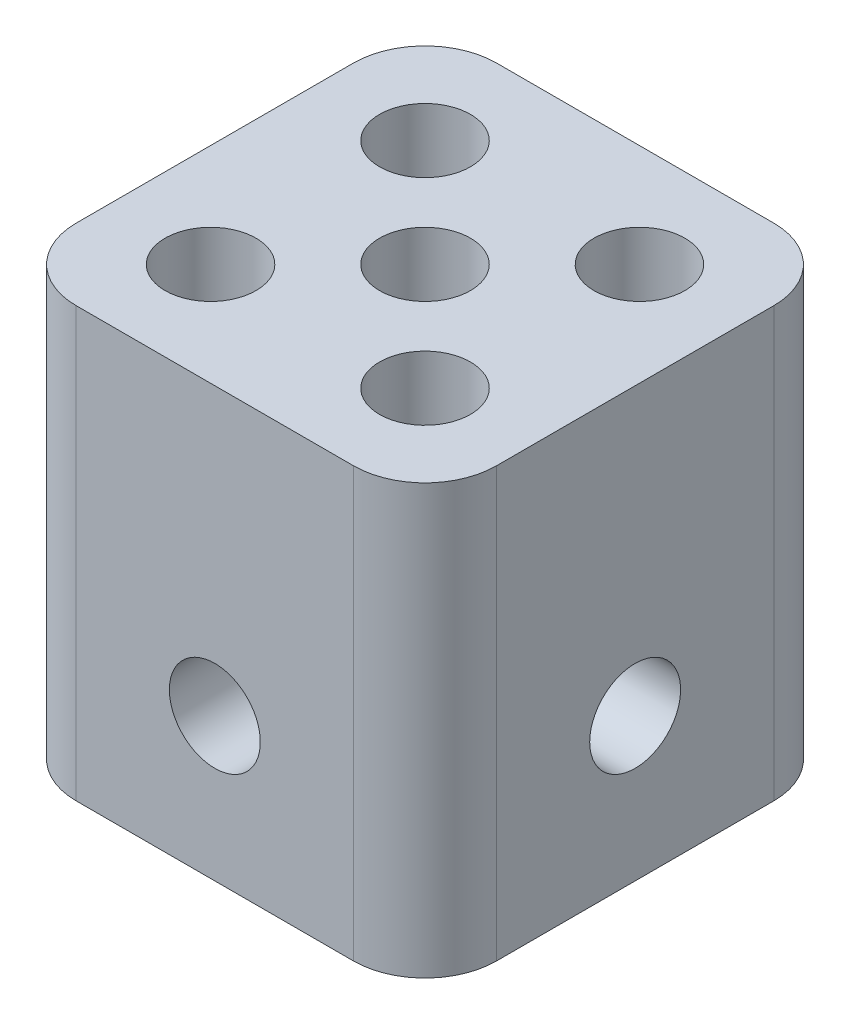
ISO-10303-21;
HEADER;
FILE_DESCRIPTION(('STEP AP214'),'2;1');
FILE_NAME('part.step','',(''),(''),'','','');
FILE_SCHEMA(('AUTOMOTIVE_DESIGN { 1 0 10303 214 1 1 1 1 }'));
ENDSEC;
DATA;
#1=APPLICATION_CONTEXT('core data for automotive mechanical design processes');
#2=APPLICATION_PROTOCOL_DEFINITION('international standard','automotive_design',2000,#1);
#3=PRODUCT_CONTEXT('',#1,'mechanical');
#4=PRODUCT('Part','Part','',(#3));
#5=PRODUCT_RELATED_PRODUCT_CATEGORY('part','',(#4));
#6=PRODUCT_DEFINITION_FORMATION('','',#4);
#7=PRODUCT_DEFINITION_CONTEXT('part definition',#1,'design');
#8=PRODUCT_DEFINITION('design','',#6,#7);
#9=PRODUCT_DEFINITION_SHAPE('','',#8);
#10=(LENGTH_UNIT() NAMED_UNIT(*) SI_UNIT(.MILLI.,.METRE.));
#11=(NAMED_UNIT(*) PLANE_ANGLE_UNIT() SI_UNIT($,.RADIAN.));
#12=(NAMED_UNIT(*) SI_UNIT($,.STERADIAN.) SOLID_ANGLE_UNIT());
#13=UNCERTAINTY_MEASURE_WITH_UNIT(LENGTH_MEASURE(1.E-05),#10,'distance_accuracy_value','');
#14=(GEOMETRIC_REPRESENTATION_CONTEXT(3) GLOBAL_UNCERTAINTY_ASSIGNED_CONTEXT((#13)) GLOBAL_UNIT_ASSIGNED_CONTEXT((#10,
#11,#12)) REPRESENTATION_CONTEXT('',''));
#15=CARTESIAN_POINT('',(0.,0.,0.));
#16=DIRECTION('',(0.,0.,1.));
#17=DIRECTION('',(1.,0.,0.));
#18=AXIS2_PLACEMENT_3D('',#15,#16,#17);
#19=CARTESIAN_POINT('',(-6.1595,19.05,-6.1595));
#20=DIRECTION('',(0.,-1.,0.));
#21=DIRECTION('',(0.,0.,-1.));
#22=AXIS2_PLACEMENT_3D('',#19,#20,#21);
#23=CYLINDRICAL_SURFACE('',#22,3.175);
#24=CARTESIAN_POINT('',(-6.1595,19.05,-6.1595));
#25=DIRECTION('',(0.,1.,0.));
#26=DIRECTION('',(0.,0.,1.));
#27=AXIS2_PLACEMENT_3D('',#24,#25,#26);
#28=CIRCLE('',#27,3.175);
#29=CARTESIAN_POINT('',(-6.1595,19.05,-9.3345));
#30=VERTEX_POINT('',#29);
#31=CARTESIAN_POINT('',(-9.3345,19.05,-6.1595));
#32=VERTEX_POINT('',#31);
#33=EDGE_CURVE('E347',#30,#32,#28,.T.);
#34=ORIENTED_EDGE('',*,*,#33,.F.);
#35=DIRECTION('',(0.,1.,0.));
#36=VECTOR('',#35,1.);
#37=CARTESIAN_POINT('',(-6.1595,19.05,-9.3345));
#38=LINE('',#37,#36);
#39=CARTESIAN_POINT('',(-6.1595,0.,-9.3345));
#40=VERTEX_POINT('',#39);
#41=EDGE_CURVE('E299',#40,#30,#38,.T.);
#42=ORIENTED_EDGE('',*,*,#41,.F.);
#43=CARTESIAN_POINT('',(-6.1595,0.,-6.1595));
#44=DIRECTION('',(0.,-1.,0.));
#45=DIRECTION('',(0.,0.,1.));
#46=AXIS2_PLACEMENT_3D('',#43,#44,#45);
#47=CIRCLE('',#46,3.175);
#48=CARTESIAN_POINT('',(-9.3345,0.,-6.1595));
#49=VERTEX_POINT('',#48);
#50=EDGE_CURVE('E27',#49,#40,#47,.T.);
#51=ORIENTED_EDGE('',*,*,#50,.F.);
#52=DIRECTION('',(0.,-1.,0.));
#53=VECTOR('',#52,1.);
#54=CARTESIAN_POINT('',(-9.3345,19.05,-6.1595));
#55=LINE('',#54,#53);
#56=EDGE_CURVE('E272',#32,#49,#55,.T.);
#57=ORIENTED_EDGE('',*,*,#56,.F.);
#58=EDGE_LOOP('',(#34,#42,#51,#57));
#59=FACE_BOUND('',#58,.T.);
#60=ADVANCED_FACE('F17',(#59),#23,.T.);
#61=CARTESIAN_POINT('',(6.1595,19.05,-6.1595));
#62=DIRECTION('',(0.,-1.,0.));
#63=DIRECTION('',(0.,0.,-1.));
#64=AXIS2_PLACEMENT_3D('',#61,#62,#63);
#65=CYLINDRICAL_SURFACE('',#64,3.175);
#66=CARTESIAN_POINT('',(6.1595,19.05,-6.1595));
#67=DIRECTION('',(0.,1.,0.));
#68=DIRECTION('',(0.,0.,1.));
#69=AXIS2_PLACEMENT_3D('',#66,#67,#68);
#70=CIRCLE('',#69,3.175);
#71=CARTESIAN_POINT('',(9.3345,19.05,-6.1595));
#72=VERTEX_POINT('',#71);
#73=CARTESIAN_POINT('',(6.1595,19.05,-9.3345));
#74=VERTEX_POINT('',#73);
#75=EDGE_CURVE('E326',#72,#74,#70,.T.);
#76=ORIENTED_EDGE('',*,*,#75,.F.);
#77=DIRECTION('',(0.,1.,0.));
#78=VECTOR('',#77,1.);
#79=CARTESIAN_POINT('',(9.3345,19.05,-6.1595));
#80=LINE('',#79,#78);
#81=CARTESIAN_POINT('',(9.3345,0.,-6.1595));
#82=VERTEX_POINT('',#81);
#83=EDGE_CURVE('E266',#82,#72,#80,.T.);
#84=ORIENTED_EDGE('',*,*,#83,.F.);
#85=CARTESIAN_POINT('',(6.1595,0.,-6.1595));
#86=DIRECTION('',(0.,-1.,0.));
#87=DIRECTION('',(0.,0.,1.));
#88=AXIS2_PLACEMENT_3D('',#85,#86,#87);
#89=CIRCLE('',#88,3.175);
#90=CARTESIAN_POINT('',(6.1595,0.,-9.3345));
#91=VERTEX_POINT('',#90);
#92=EDGE_CURVE('E11',#91,#82,#89,.T.);
#93=ORIENTED_EDGE('',*,*,#92,.F.);
#94=DIRECTION('',(0.,-1.,0.));
#95=VECTOR('',#94,1.);
#96=CARTESIAN_POINT('',(6.1595,19.05,-9.3345));
#97=LINE('',#96,#95);
#98=EDGE_CURVE('E265',#74,#91,#97,.T.);
#99=ORIENTED_EDGE('',*,*,#98,.F.);
#100=EDGE_LOOP('',(#76,#84,#93,#99));
#101=FACE_BOUND('',#100,.T.);
#102=ADVANCED_FACE('F466',(#101),#65,.T.);
#103=CARTESIAN_POINT('',(-6.1595,19.05,6.1595));
#104=DIRECTION('',(0.,-1.,0.));
#105=DIRECTION('',(0.,0.,-1.));
#106=AXIS2_PLACEMENT_3D('',#103,#104,#105);
#107=CYLINDRICAL_SURFACE('',#106,3.175);
#108=CARTESIAN_POINT('',(-6.1595,19.05,6.1595));
#109=DIRECTION('',(0.,1.,0.));
#110=DIRECTION('',(0.,0.,1.));
#111=AXIS2_PLACEMENT_3D('',#108,#109,#110);
#112=CIRCLE('',#111,3.175);
#113=CARTESIAN_POINT('',(-9.3345,19.05,6.1595));
#114=VERTEX_POINT('',#113);
#115=CARTESIAN_POINT('',(-6.1595,19.05,9.3345));
#116=VERTEX_POINT('',#115);
#117=EDGE_CURVE('E40',#114,#116,#112,.T.);
#118=ORIENTED_EDGE('',*,*,#117,.F.);
#119=DIRECTION('',(0.,1.,0.));
#120=VECTOR('',#119,1.);
#121=CARTESIAN_POINT('',(-9.3345,19.05,6.1595));
#122=LINE('',#121,#120);
#123=CARTESIAN_POINT('',(-9.3345,0.,6.1595));
#124=VERTEX_POINT('',#123);
#125=EDGE_CURVE('E273',#124,#114,#122,.T.);
#126=ORIENTED_EDGE('',*,*,#125,.F.);
#127=CARTESIAN_POINT('',(-6.1595,0.,6.1595));
#128=DIRECTION('',(0.,-1.,0.));
#129=DIRECTION('',(0.,0.,1.));
#130=AXIS2_PLACEMENT_3D('',#127,#128,#129);
#131=CIRCLE('',#130,3.175);
#132=CARTESIAN_POINT('',(-6.1595,0.,9.3345));
#133=VERTEX_POINT('',#132);
#134=EDGE_CURVE('E337',#133,#124,#131,.T.);
#135=ORIENTED_EDGE('',*,*,#134,.F.);
#136=DIRECTION('',(0.,-1.,0.));
#137=VECTOR('',#136,1.);
#138=CARTESIAN_POINT('',(-6.1595,19.05,9.3345));
#139=LINE('',#138,#137);
#140=EDGE_CURVE('E250',#116,#133,#139,.T.);
#141=ORIENTED_EDGE('',*,*,#140,.F.);
#142=EDGE_LOOP('',(#118,#126,#135,#141));
#143=FACE_BOUND('',#142,.T.);
#144=ADVANCED_FACE('F455',(#143),#107,.T.);
#145=CARTESIAN_POINT('',(6.1595,19.05,6.1595));
#146=DIRECTION('',(0.,-1.,0.));
#147=DIRECTION('',(0.,0.,-1.));
#148=AXIS2_PLACEMENT_3D('',#145,#146,#147);
#149=CYLINDRICAL_SURFACE('',#148,3.175);
#150=CARTESIAN_POINT('',(6.1595,19.05,6.1595));
#151=DIRECTION('',(0.,1.,0.));
#152=DIRECTION('',(0.,0.,1.));
#153=AXIS2_PLACEMENT_3D('',#150,#151,#152);
#154=CIRCLE('',#153,3.175);
#155=CARTESIAN_POINT('',(6.1595,19.05,9.3345));
#156=VERTEX_POINT('',#155);
#157=CARTESIAN_POINT('',(9.3345,19.05,6.1595));
#158=VERTEX_POINT('',#157);
#159=EDGE_CURVE('E323',#156,#158,#154,.T.);
#160=ORIENTED_EDGE('',*,*,#159,.F.);
#161=DIRECTION('',(0.,1.,0.));
#162=VECTOR('',#161,1.);
#163=CARTESIAN_POINT('',(6.1595,19.05,9.3345));
#164=LINE('',#163,#162);
#165=CARTESIAN_POINT('',(6.1595,0.,9.3345));
#166=VERTEX_POINT('',#165);
#167=EDGE_CURVE('E251',#166,#156,#164,.T.);
#168=ORIENTED_EDGE('',*,*,#167,.F.);
#169=CARTESIAN_POINT('',(6.1595,0.,6.1595));
#170=DIRECTION('',(0.,-1.,0.));
#171=DIRECTION('',(0.,0.,1.));
#172=AXIS2_PLACEMENT_3D('',#169,#170,#171);
#173=CIRCLE('',#172,3.175);
#174=CARTESIAN_POINT('',(9.3345,0.,6.1595));
#175=VERTEX_POINT('',#174);
#176=EDGE_CURVE('E334',#175,#166,#173,.T.);
#177=ORIENTED_EDGE('',*,*,#176,.F.);
#178=DIRECTION('',(0.,-1.,0.));
#179=VECTOR('',#178,1.);
#180=CARTESIAN_POINT('',(9.3345,19.05,6.1595));
#181=LINE('',#180,#179);
#182=EDGE_CURVE('E258',#158,#175,#181,.T.);
#183=ORIENTED_EDGE('',*,*,#182,.F.);
#184=EDGE_LOOP('',(#160,#168,#177,#183));
#185=FACE_BOUND('',#184,.T.);
#186=ADVANCED_FACE('F473',(#185),#149,.T.);
#187=CARTESIAN_POINT('',(0.,0.,0.));
#188=DIRECTION('',(0.,1.,0.));
#189=DIRECTION('',(0.,0.,1.));
#190=AXIS2_PLACEMENT_3D('',#187,#188,#189);
#191=PLANE('',#190);
#192=DIRECTION('',(0.,0.,-1.));
#193=VECTOR('',#192,1.);
#194=CARTESIAN_POINT('',(9.3345,0.,-9.3345));
#195=LINE('',#194,#193);
#196=EDGE_CURVE('E283',#175,#82,#195,.T.);
#197=ORIENTED_EDGE('',*,*,#196,.F.);
#198=ORIENTED_EDGE('',*,*,#176,.T.);
#199=DIRECTION('',(1.,0.,0.));
#200=VECTOR('',#199,1.);
#201=CARTESIAN_POINT('',(-9.3345,0.,9.3345));
#202=LINE('',#201,#200);
#203=EDGE_CURVE('E289',#133,#166,#202,.T.);
#204=ORIENTED_EDGE('',*,*,#203,.F.);
#205=ORIENTED_EDGE('',*,*,#134,.T.);
#206=DIRECTION('',(0.,0.,1.));
#207=VECTOR('',#206,1.);
#208=CARTESIAN_POINT('',(-9.3345,0.,-9.3345));
#209=LINE('',#208,#207);
#210=EDGE_CURVE('E295',#49,#124,#209,.T.);
#211=ORIENTED_EDGE('',*,*,#210,.F.);
#212=ORIENTED_EDGE('',*,*,#50,.T.);
#213=DIRECTION('',(-1.,0.,0.));
#214=VECTOR('',#213,1.);
#215=CARTESIAN_POINT('',(-9.3345,0.,-9.3345));
#216=LINE('',#215,#214);
#217=EDGE_CURVE('E302',#91,#40,#216,.T.);
#218=ORIENTED_EDGE('',*,*,#217,.F.);
#219=ORIENTED_EDGE('',*,*,#92,.T.);
#220=EDGE_LOOP('',(#197,#198,#204,#205,#211,#212,#218,#219));
#221=FACE_BOUND('',#220,.T.);
#222=CARTESIAN_POINT('',(-4.7625,0.,-4.7625));
#223=DIRECTION('',(0.,1.,0.));
#224=DIRECTION('',(0.,0.,1.));
#225=AXIS2_PLACEMENT_3D('',#222,#223,#224);
#226=CIRCLE('',#225,2.0193);
#227=CARTESIAN_POINT('',(-4.7625,0.,-2.7432));
#228=VERTEX_POINT('',#227);
#229=EDGE_CURVE('E246',#228,#228,#226,.T.);
#230=ORIENTED_EDGE('',*,*,#229,.T.);
#231=EDGE_LOOP('',(#230));
#232=FACE_BOUND('',#231,.T.);
#233=CARTESIAN_POINT('',(-4.7625,0.,4.7625));
#234=DIRECTION('',(0.,1.,0.));
#235=DIRECTION('',(0.,0.,1.));
#236=AXIS2_PLACEMENT_3D('',#233,#234,#235);
#237=CIRCLE('',#236,2.0193);
#238=CARTESIAN_POINT('',(-4.7625,0.,6.7818));
#239=VERTEX_POINT('',#238);
#240=EDGE_CURVE('E240',#239,#239,#237,.T.);
#241=ORIENTED_EDGE('',*,*,#240,.T.);
#242=EDGE_LOOP('',(#241));
#243=FACE_BOUND('',#242,.T.);
#244=CARTESIAN_POINT('',(4.7625,0.,4.7625));
#245=DIRECTION('',(0.,1.,0.));
#246=DIRECTION('',(0.,0.,1.));
#247=AXIS2_PLACEMENT_3D('',#244,#245,#246);
#248=CIRCLE('',#247,2.0193);
#249=CARTESIAN_POINT('',(4.7625,0.,6.7818));
#250=VERTEX_POINT('',#249);
#251=EDGE_CURVE('E241',#250,#250,#248,.T.);
#252=ORIENTED_EDGE('',*,*,#251,.T.);
#253=EDGE_LOOP('',(#252));
#254=FACE_BOUND('',#253,.T.);
#255=CARTESIAN_POINT('',(4.7625,0.,-4.7625));
#256=DIRECTION('',(0.,1.,0.));
#257=DIRECTION('',(0.,0.,1.));
#258=AXIS2_PLACEMENT_3D('',#255,#256,#257);
#259=CIRCLE('',#258,2.0193);
#260=CARTESIAN_POINT('',(4.7625,0.,-2.7432));
#261=VERTEX_POINT('',#260);
#262=EDGE_CURVE('E219',#261,#261,#259,.T.);
#263=ORIENTED_EDGE('',*,*,#262,.T.);
#264=EDGE_LOOP('',(#263));
#265=FACE_BOUND('',#264,.T.);
#266=CARTESIAN_POINT('',(0.,0.,0.));
#267=DIRECTION('',(0.,1.,0.));
#268=DIRECTION('',(0.,0.,1.));
#269=AXIS2_PLACEMENT_3D('',#266,#267,#268);
#270=CIRCLE('',#269,2.0193);
#271=CARTESIAN_POINT('',(0.,0.,2.0193));
#272=VERTEX_POINT('',#271);
#273=EDGE_CURVE('E213',#272,#272,#270,.T.);
#274=ORIENTED_EDGE('',*,*,#273,.T.);
#275=EDGE_LOOP('',(#274));
#276=FACE_BOUND('',#275,.T.);
#277=ADVANCED_FACE('F448',(#221,#232,#243,#254,#265,#276),#191,.F.);
#278=CARTESIAN_POINT('',(0.,19.05,0.));
#279=DIRECTION('',(0.,1.,0.));
#280=DIRECTION('',(0.,0.,1.));
#281=AXIS2_PLACEMENT_3D('',#278,#279,#280);
#282=PLANE('',#281);
#283=DIRECTION('',(1.,0.,0.));
#284=VECTOR('',#283,1.);
#285=CARTESIAN_POINT('',(-9.3345,19.05,9.3345));
#286=LINE('',#285,#284);
#287=EDGE_CURVE('E247',#116,#156,#286,.T.);
#288=ORIENTED_EDGE('',*,*,#287,.T.);
#289=ORIENTED_EDGE('',*,*,#159,.T.);
#290=DIRECTION('',(0.,0.,-1.));
#291=VECTOR('',#290,1.);
#292=CARTESIAN_POINT('',(9.3345,19.05,-9.3345));
#293=LINE('',#292,#291);
#294=EDGE_CURVE('E254',#158,#72,#293,.T.);
#295=ORIENTED_EDGE('',*,*,#294,.T.);
#296=ORIENTED_EDGE('',*,*,#75,.T.);
#297=DIRECTION('',(-1.,0.,0.));
#298=VECTOR('',#297,1.);
#299=CARTESIAN_POINT('',(-9.3345,19.05,-9.3345));
#300=LINE('',#299,#298);
#301=EDGE_CURVE('E261',#74,#30,#300,.T.);
#302=ORIENTED_EDGE('',*,*,#301,.T.);
#303=ORIENTED_EDGE('',*,*,#33,.T.);
#304=DIRECTION('',(0.,0.,1.));
#305=VECTOR('',#304,1.);
#306=CARTESIAN_POINT('',(-9.3345,19.05,-9.3345));
#307=LINE('',#306,#305);
#308=EDGE_CURVE('E269',#32,#114,#307,.T.);
#309=ORIENTED_EDGE('',*,*,#308,.T.);
#310=ORIENTED_EDGE('',*,*,#117,.T.);
#311=EDGE_LOOP('',(#288,#289,#295,#296,#302,#303,#309,#310));
#312=FACE_BOUND('',#311,.T.);
#313=CARTESIAN_POINT('',(-4.7625,19.05,-4.7625));
#314=DIRECTION('',(0.,1.,0.));
#315=DIRECTION('',(0.,0.,1.));
#316=AXIS2_PLACEMENT_3D('',#313,#314,#315);
#317=CIRCLE('',#316,2.0193);
#318=CARTESIAN_POINT('',(-4.7625,19.05,-2.7432));
#319=VERTEX_POINT('',#318);
#320=EDGE_CURVE('E162',#319,#319,#317,.T.);
#321=ORIENTED_EDGE('',*,*,#320,.F.);
#322=EDGE_LOOP('',(#321));
#323=FACE_BOUND('',#322,.T.);
#324=CARTESIAN_POINT('',(-4.7625,19.05,4.7625));
#325=DIRECTION('',(0.,1.,0.));
#326=DIRECTION('',(0.,0.,1.));
#327=AXIS2_PLACEMENT_3D('',#324,#325,#326);
#328=CIRCLE('',#327,2.0193);
#329=CARTESIAN_POINT('',(-4.7625,19.05,6.7818));
#330=VERTEX_POINT('',#329);
#331=EDGE_CURVE('E242',#330,#330,#328,.T.);
#332=ORIENTED_EDGE('',*,*,#331,.F.);
#333=EDGE_LOOP('',(#332));
#334=FACE_BOUND('',#333,.T.);
#335=CARTESIAN_POINT('',(4.7625,19.05,4.7625));
#336=DIRECTION('',(0.,1.,0.));
#337=DIRECTION('',(0.,0.,1.));
#338=AXIS2_PLACEMENT_3D('',#335,#336,#337);
#339=CIRCLE('',#338,2.0193);
#340=CARTESIAN_POINT('',(4.7625,19.05,6.7818));
#341=VERTEX_POINT('',#340);
#342=EDGE_CURVE('E236',#341,#341,#339,.T.);
#343=ORIENTED_EDGE('',*,*,#342,.F.);
#344=EDGE_LOOP('',(#343));
#345=FACE_BOUND('',#344,.T.);
#346=CARTESIAN_POINT('',(4.7625,19.05,-4.7625));
#347=DIRECTION('',(0.,1.,0.));
#348=DIRECTION('',(0.,0.,1.));
#349=AXIS2_PLACEMENT_3D('',#346,#347,#348);
#350=CIRCLE('',#349,2.0193);
#351=CARTESIAN_POINT('',(4.7625,19.05,-2.7432));
#352=VERTEX_POINT('',#351);
#353=EDGE_CURVE('E279',#352,#352,#350,.T.);
#354=ORIENTED_EDGE('',*,*,#353,.F.);
#355=EDGE_LOOP('',(#354));
#356=FACE_BOUND('',#355,.T.);
#357=CARTESIAN_POINT('',(0.,19.05,0.));
#358=DIRECTION('',(0.,1.,0.));
#359=DIRECTION('',(0.,0.,1.));
#360=AXIS2_PLACEMENT_3D('',#357,#358,#359);
#361=CIRCLE('',#360,2.0193);
#362=CARTESIAN_POINT('',(0.,19.05,2.0193));
#363=VERTEX_POINT('',#362);
#364=EDGE_CURVE('E148',#363,#363,#361,.T.);
#365=ORIENTED_EDGE('',*,*,#364,.F.);
#366=EDGE_LOOP('',(#365));
#367=FACE_BOUND('',#366,.T.);
#368=ADVANCED_FACE('F457',(#312,#323,#334,#345,#356,#367),#282,.T.);
#369=CARTESIAN_POINT('',(-9.3345,19.05,9.3345));
#370=DIRECTION('',(0.,0.,-1.));
#371=DIRECTION('',(-1.,0.,0.));
#372=AXIS2_PLACEMENT_3D('',#369,#370,#371);
#373=PLANE('',#372);
#374=ORIENTED_EDGE('',*,*,#203,.T.);
#375=ORIENTED_EDGE('',*,*,#167,.T.);
#376=ORIENTED_EDGE('',*,*,#287,.F.);
#377=ORIENTED_EDGE('',*,*,#140,.T.);
#378=EDGE_LOOP('',(#374,#375,#376,#377));
#379=FACE_BOUND('',#378,.T.);
#380=CARTESIAN_POINT('',(0.,6.35,9.3345));
#381=DIRECTION('',(0.,0.,-1.));
#382=DIRECTION('',(-1.,0.,0.));
#383=AXIS2_PLACEMENT_3D('',#380,#381,#382);
#384=CIRCLE('',#383,2.0193);
#385=CARTESIAN_POINT('',(-2.0193,6.35,9.3345));
#386=VERTEX_POINT('',#385);
#387=EDGE_CURVE('E169',#386,#386,#384,.T.);
#388=ORIENTED_EDGE('',*,*,#387,.T.);
#389=EDGE_LOOP('',(#388));
#390=FACE_BOUND('',#389,.T.);
#391=ADVANCED_FACE('F476',(#379,#390),#373,.F.);
#392=CARTESIAN_POINT('',(-9.3345,19.05,-9.3345));
#393=DIRECTION('',(1.,0.,0.));
#394=DIRECTION('',(0.,0.,-1.));
#395=AXIS2_PLACEMENT_3D('',#392,#393,#394);
#396=PLANE('',#395);
#397=ORIENTED_EDGE('',*,*,#210,.T.);
#398=ORIENTED_EDGE('',*,*,#125,.T.);
#399=ORIENTED_EDGE('',*,*,#308,.F.);
#400=ORIENTED_EDGE('',*,*,#56,.T.);
#401=EDGE_LOOP('',(#397,#398,#399,#400));
#402=FACE_BOUND('',#401,.T.);
#403=CARTESIAN_POINT('',(-9.3345,6.35,0.));
#404=DIRECTION('',(-1.,0.,0.));
#405=DIRECTION('',(0.,0.,1.));
#406=AXIS2_PLACEMENT_3D('',#403,#404,#405);
#407=CIRCLE('',#406,2.0193);
#408=CARTESIAN_POINT('',(-9.3345,6.35,2.0193));
#409=VERTEX_POINT('',#408);
#410=EDGE_CURVE('E133',#409,#409,#407,.T.);
#411=ORIENTED_EDGE('',*,*,#410,.F.);
#412=EDGE_LOOP('',(#411));
#413=FACE_BOUND('',#412,.T.);
#414=ADVANCED_FACE('F443',(#402,#413),#396,.F.);
#415=CARTESIAN_POINT('',(-9.3345,19.05,-9.3345));
#416=DIRECTION('',(0.,0.,1.));
#417=DIRECTION('',(1.,0.,0.));
#418=AXIS2_PLACEMENT_3D('',#415,#416,#417);
#419=PLANE('',#418);
#420=ORIENTED_EDGE('',*,*,#301,.F.);
#421=ORIENTED_EDGE('',*,*,#98,.T.);
#422=ORIENTED_EDGE('',*,*,#217,.T.);
#423=ORIENTED_EDGE('',*,*,#41,.T.);
#424=EDGE_LOOP('',(#420,#421,#422,#423));
#425=FACE_BOUND('',#424,.T.);
#426=CARTESIAN_POINT('',(0.,6.35,-9.3345));
#427=DIRECTION('',(0.,0.,-1.));
#428=DIRECTION('',(-1.,0.,0.));
#429=AXIS2_PLACEMENT_3D('',#426,#427,#428);
#430=CIRCLE('',#429,2.0193);
#431=CARTESIAN_POINT('',(-2.0193,6.35,-9.3345));
#432=VERTEX_POINT('',#431);
#433=EDGE_CURVE('E168',#432,#432,#430,.T.);
#434=ORIENTED_EDGE('',*,*,#433,.F.);
#435=EDGE_LOOP('',(#434));
#436=FACE_BOUND('',#435,.T.);
#437=ADVANCED_FACE('F461',(#425,#436),#419,.F.);
#438=CARTESIAN_POINT('',(9.3345,19.05,-9.3345));
#439=DIRECTION('',(-1.,0.,0.));
#440=DIRECTION('',(0.,0.,1.));
#441=AXIS2_PLACEMENT_3D('',#438,#439,#440);
#442=PLANE('',#441);
#443=ORIENTED_EDGE('',*,*,#294,.F.);
#444=ORIENTED_EDGE('',*,*,#182,.T.);
#445=ORIENTED_EDGE('',*,*,#196,.T.);
#446=ORIENTED_EDGE('',*,*,#83,.T.);
#447=EDGE_LOOP('',(#443,#444,#445,#446));
#448=FACE_BOUND('',#447,.T.);
#449=CARTESIAN_POINT('',(9.3345,6.35,0.));
#450=DIRECTION('',(-1.,0.,0.));
#451=DIRECTION('',(0.,0.,1.));
#452=AXIS2_PLACEMENT_3D('',#449,#450,#451);
#453=CIRCLE('',#452,2.0193);
#454=CARTESIAN_POINT('',(9.3345,6.35,2.0193));
#455=VERTEX_POINT('',#454);
#456=EDGE_CURVE('E181',#455,#455,#453,.T.);
#457=ORIENTED_EDGE('',*,*,#456,.T.);
#458=EDGE_LOOP('',(#457));
#459=FACE_BOUND('',#458,.T.);
#460=ADVANCED_FACE('F469',(#448,#459),#442,.F.);
#461=CARTESIAN_POINT('',(0.,19.05,0.));
#462=DIRECTION('',(0.,1.,0.));
#463=DIRECTION('',(0.,0.,1.));
#464=AXIS2_PLACEMENT_3D('',#461,#462,#463);
#465=CYLINDRICAL_SURFACE('',#464,2.0193);
#466=ORIENTED_EDGE('',*,*,#364,.T.);
#467=EDGE_LOOP('',(#466));
#468=FACE_BOUND('',#467,.T.);
#469=CARTESIAN_POINT('',(0.,6.35,0.));
#470=DIRECTION('',(0.,-0.707106781186548,-0.707106781186548));
#471=DIRECTION('',(0.,0.707106781186548,-0.707106781186548));
#472=AXIS2_PLACEMENT_3D('',#469,#470,#471);
#473=ELLIPSE('',#472,2.85572144649998,2.0193);
#474=CARTESIAN_POINT('',(-1.42786072324999,7.77786072324999,-1.42786072324999));
#475=VERTEX_POINT('',#474);
#476=CARTESIAN_POINT('',(1.42786072324999,7.77786072324999,-1.42786072324999));
#477=VERTEX_POINT('',#476);
#478=EDGE_CURVE('E153',#475,#477,#473,.T.);
#479=ORIENTED_EDGE('',*,*,#478,.T.);
#480=CARTESIAN_POINT('',(0.,6.35,0.));
#481=DIRECTION('',(0.707106781186548,-0.707106781186548,0.));
#482=DIRECTION('',(0.707106781186548,0.707106781186548,0.));
#483=AXIS2_PLACEMENT_3D('',#480,#481,#482);
#484=ELLIPSE('',#483,2.85572144649998,2.0193);
#485=CARTESIAN_POINT('',(1.42786072324999,7.77786072324999,1.42786072324999));
#486=VERTEX_POINT('',#485);
#487=EDGE_CURVE('E142',#477,#486,#484,.T.);
#488=ORIENTED_EDGE('',*,*,#487,.T.);
#489=CARTESIAN_POINT('',(0.,6.35,0.));
#490=DIRECTION('',(0.,-0.707106781186548,0.707106781186548));
#491=DIRECTION('',(0.,0.707106781186548,0.707106781186548));
#492=AXIS2_PLACEMENT_3D('',#489,#490,#491);
#493=ELLIPSE('',#492,2.85572144649998,2.0193);
#494=CARTESIAN_POINT('',(-1.42786072324999,7.77786072324999,1.42786072324999));
#495=VERTEX_POINT('',#494);
#496=EDGE_CURVE('E124',#486,#495,#493,.T.);
#497=ORIENTED_EDGE('',*,*,#496,.T.);
#498=CARTESIAN_POINT('',(0.,6.35,0.));
#499=DIRECTION('',(-0.707106781186548,-0.707106781186548,0.));
#500=DIRECTION('',(-0.707106781186548,0.707106781186548,0.));
#501=AXIS2_PLACEMENT_3D('',#498,#499,#500);
#502=ELLIPSE('',#501,2.85572144649998,2.0193);
#503=EDGE_CURVE('E135',#495,#475,#502,.T.);
#504=ORIENTED_EDGE('',*,*,#503,.T.);
#505=EDGE_LOOP('',(#479,#488,#497,#504));
#506=FACE_BOUND('',#505,.T.);
#507=ADVANCED_FACE('F145',(#468,#506),#465,.F.);
#508=CARTESIAN_POINT('',(-4.7625,19.05,-4.7625));
#509=DIRECTION('',(0.,1.,0.));
#510=DIRECTION('',(0.,0.,1.));
#511=AXIS2_PLACEMENT_3D('',#508,#509,#510);
#512=CYLINDRICAL_SURFACE('',#511,2.0193);
#513=ORIENTED_EDGE('',*,*,#320,.T.);
#514=EDGE_LOOP('',(#513));
#515=FACE_BOUND('',#514,.T.);
#516=ORIENTED_EDGE('',*,*,#229,.F.);
#517=EDGE_LOOP('',(#516));
#518=FACE_BOUND('',#517,.T.);
#519=ADVANCED_FACE('F502',(#515,#518),#512,.F.);
#520=CARTESIAN_POINT('',(-4.7625,19.05,4.7625));
#521=DIRECTION('',(0.,1.,0.));
#522=DIRECTION('',(0.,0.,1.));
#523=AXIS2_PLACEMENT_3D('',#520,#521,#522);
#524=CYLINDRICAL_SURFACE('',#523,2.0193);
#525=ORIENTED_EDGE('',*,*,#331,.T.);
#526=EDGE_LOOP('',(#525));
#527=FACE_BOUND('',#526,.T.);
#528=ORIENTED_EDGE('',*,*,#240,.F.);
#529=EDGE_LOOP('',(#528));
#530=FACE_BOUND('',#529,.T.);
#531=ADVANCED_FACE('F505',(#527,#530),#524,.F.);
#532=CARTESIAN_POINT('',(4.7625,19.05,4.7625));
#533=DIRECTION('',(0.,1.,0.));
#534=DIRECTION('',(0.,0.,1.));
#535=AXIS2_PLACEMENT_3D('',#532,#533,#534);
#536=CYLINDRICAL_SURFACE('',#535,2.0193);
#537=ORIENTED_EDGE('',*,*,#342,.T.);
#538=EDGE_LOOP('',(#537));
#539=FACE_BOUND('',#538,.T.);
#540=ORIENTED_EDGE('',*,*,#251,.F.);
#541=EDGE_LOOP('',(#540));
#542=FACE_BOUND('',#541,.T.);
#543=ADVANCED_FACE('F573',(#539,#542),#536,.F.);
#544=CARTESIAN_POINT('',(4.7625,19.05,-4.7625));
#545=DIRECTION('',(0.,1.,0.));
#546=DIRECTION('',(0.,0.,1.));
#547=AXIS2_PLACEMENT_3D('',#544,#545,#546);
#548=CYLINDRICAL_SURFACE('',#547,2.0193);
#549=ORIENTED_EDGE('',*,*,#353,.T.);
#550=EDGE_LOOP('',(#549));
#551=FACE_BOUND('',#550,.T.);
#552=ORIENTED_EDGE('',*,*,#262,.F.);
#553=EDGE_LOOP('',(#552));
#554=FACE_BOUND('',#553,.T.);
#555=ADVANCED_FACE('F583',(#551,#554),#548,.F.);
#556=CARTESIAN_POINT('',(0.,6.35,0.));
#557=DIRECTION('',(-0.707106781186548,0.707106781186548,0.));
#558=DIRECTION('',(0.707106781186548,0.707106781186548,0.));
#559=AXIS2_PLACEMENT_3D('',#556,#557,#558);
#560=ELLIPSE('',#559,2.85572144649998,2.0193);
#561=CARTESIAN_POINT('',(-1.42786072324999,4.92213927675001,-1.42786072324999));
#562=VERTEX_POINT('',#561);
#563=CARTESIAN_POINT('',(-1.42786072324999,4.92213927675001,1.42786072324999));
#564=VERTEX_POINT('',#563);
#565=EDGE_CURVE('E132',#562,#564,#560,.T.);
#566=ORIENTED_EDGE('',*,*,#565,.T.);
#567=CARTESIAN_POINT('',(0.,6.35,0.));
#568=DIRECTION('',(0.,0.707106781186548,0.707106781186548));
#569=DIRECTION('',(0.,0.707106781186548,-0.707106781186548));
#570=AXIS2_PLACEMENT_3D('',#567,#568,#569);
#571=ELLIPSE('',#570,2.85572144649998,2.0193);
#572=CARTESIAN_POINT('',(1.42786072324999,4.92213927675001,1.42786072324999));
#573=VERTEX_POINT('',#572);
#574=EDGE_CURVE('E127',#564,#573,#571,.T.);
#575=ORIENTED_EDGE('',*,*,#574,.T.);
#576=CARTESIAN_POINT('',(0.,6.35,0.));
#577=DIRECTION('',(0.707106781186548,0.707106781186548,0.));
#578=DIRECTION('',(-0.707106781186548,0.707106781186548,0.));
#579=AXIS2_PLACEMENT_3D('',#576,#577,#578);
#580=ELLIPSE('',#579,2.85572144649998,2.0193);
#581=CARTESIAN_POINT('',(1.42786072324999,4.92213927675001,-1.42786072324999));
#582=VERTEX_POINT('',#581);
#583=EDGE_CURVE('E170',#573,#582,#580,.T.);
#584=ORIENTED_EDGE('',*,*,#583,.T.);
#585=CARTESIAN_POINT('',(0.,6.35,0.));
#586=DIRECTION('',(0.,0.707106781186548,-0.707106781186548));
#587=DIRECTION('',(0.,0.707106781186548,0.707106781186548));
#588=AXIS2_PLACEMENT_3D('',#585,#586,#587);
#589=ELLIPSE('',#588,2.85572144649998,2.0193);
#590=EDGE_CURVE('E205',#582,#562,#589,.T.);
#591=ORIENTED_EDGE('',*,*,#590,.T.);
#592=EDGE_LOOP('',(#566,#575,#584,#591));
#593=FACE_BOUND('',#592,.T.);
#594=ORIENTED_EDGE('',*,*,#273,.F.);
#595=EDGE_LOOP('',(#594));
#596=FACE_BOUND('',#595,.T.);
#597=ADVANCED_FACE('F202',(#593,#596),#465,.F.);
#598=CARTESIAN_POINT('',(0.,6.35,-9.3345));
#599=DIRECTION('',(0.,0.,-1.));
#600=DIRECTION('',(-1.,0.,0.));
#601=AXIS2_PLACEMENT_3D('',#598,#599,#600);
#602=CYLINDRICAL_SURFACE('',#601,2.0193);
#603=ORIENTED_EDGE('',*,*,#433,.T.);
#604=EDGE_LOOP('',(#603));
#605=FACE_BOUND('',#604,.T.);
#606=CARTESIAN_POINT('',(0.,6.35,0.));
#607=DIRECTION('',(0.707106781186548,0.,0.707106781186548));
#608=DIRECTION('',(0.707106781186548,0.,-0.707106781186548));
#609=AXIS2_PLACEMENT_3D('',#606,#607,#608);
#610=ELLIPSE('',#609,2.85572144649998,2.0193);
#611=EDGE_CURVE('E177',#582,#477,#610,.T.);
#612=ORIENTED_EDGE('',*,*,#611,.T.);
#613=ORIENTED_EDGE('',*,*,#478,.F.);
#614=CARTESIAN_POINT('',(0.,6.35,0.));
#615=DIRECTION('',(-0.707106781186548,0.,0.707106781186548));
#616=DIRECTION('',(-0.707106781186548,0.,-0.707106781186548));
#617=AXIS2_PLACEMENT_3D('',#614,#615,#616);
#618=ELLIPSE('',#617,2.85572144649998,2.0193);
#619=EDGE_CURVE('E138',#475,#562,#618,.T.);
#620=ORIENTED_EDGE('',*,*,#619,.T.);
#621=ORIENTED_EDGE('',*,*,#590,.F.);
#622=EDGE_LOOP('',(#612,#613,#620,#621));
#623=FACE_BOUND('',#622,.T.);
#624=ADVANCED_FACE('F211',(#605,#623),#602,.F.);
#625=CARTESIAN_POINT('',(0.,6.35,0.));
#626=DIRECTION('',(-0.707106781186548,0.,-0.707106781186548));
#627=DIRECTION('',(0.707106781186548,0.,-0.707106781186548));
#628=AXIS2_PLACEMENT_3D('',#625,#626,#627);
#629=ELLIPSE('',#628,2.85572144649998,2.0193);
#630=EDGE_CURVE('E118',#564,#495,#629,.T.);
#631=ORIENTED_EDGE('',*,*,#630,.T.);
#632=ORIENTED_EDGE('',*,*,#496,.F.);
#633=CARTESIAN_POINT('',(0.,6.35,0.));
#634=DIRECTION('',(0.707106781186548,0.,-0.707106781186548));
#635=DIRECTION('',(-0.707106781186548,0.,-0.707106781186548));
#636=AXIS2_PLACEMENT_3D('',#633,#634,#635);
#637=ELLIPSE('',#636,2.85572144649998,2.0193);
#638=EDGE_CURVE('E186',#486,#573,#637,.T.);
#639=ORIENTED_EDGE('',*,*,#638,.T.);
#640=ORIENTED_EDGE('',*,*,#574,.F.);
#641=EDGE_LOOP('',(#631,#632,#639,#640));
#642=FACE_BOUND('',#641,.T.);
#643=ORIENTED_EDGE('',*,*,#387,.F.);
#644=EDGE_LOOP('',(#643));
#645=FACE_BOUND('',#644,.T.);
#646=ADVANCED_FACE('F120',(#642,#645),#602,.F.);
#647=CARTESIAN_POINT('',(-9.3345,6.35,0.));
#648=DIRECTION('',(-1.,0.,0.));
#649=DIRECTION('',(0.,0.,1.));
#650=AXIS2_PLACEMENT_3D('',#647,#648,#649);
#651=CYLINDRICAL_SURFACE('',#650,2.0193);
#652=ORIENTED_EDGE('',*,*,#410,.T.);
#653=EDGE_LOOP('',(#652));
#654=FACE_BOUND('',#653,.T.);
#655=ORIENTED_EDGE('',*,*,#619,.F.);
#656=ORIENTED_EDGE('',*,*,#503,.F.);
#657=ORIENTED_EDGE('',*,*,#630,.F.);
#658=ORIENTED_EDGE('',*,*,#565,.F.);
#659=EDGE_LOOP('',(#655,#656,#657,#658));
#660=FACE_BOUND('',#659,.T.);
#661=ADVANCED_FACE('F136',(#654,#660),#651,.F.);
#662=ORIENTED_EDGE('',*,*,#638,.F.);
#663=ORIENTED_EDGE('',*,*,#487,.F.);
#664=ORIENTED_EDGE('',*,*,#611,.F.);
#665=ORIENTED_EDGE('',*,*,#583,.F.);
#666=EDGE_LOOP('',(#662,#663,#664,#665));
#667=FACE_BOUND('',#666,.T.);
#668=ORIENTED_EDGE('',*,*,#456,.F.);
#669=EDGE_LOOP('',(#668));
#670=FACE_BOUND('',#669,.T.);
#671=ADVANCED_FACE('F208',(#667,#670),#651,.F.);
#672=CLOSED_SHELL('',(#60,#102,#144,#186,#277,#368,#391,#414,#437,#460,#507,#519,#531,#543,#555,
#597,#624,#646,#661,#671));
#673=MANIFOLD_SOLID_BREP('B1',#672);
#674=ADVANCED_BREP_SHAPE_REPRESENTATION('',(#18,#673),#14);
#675=SHAPE_DEFINITION_REPRESENTATION(#9,#674);
ENDSEC;
END-ISO-10303-21;
